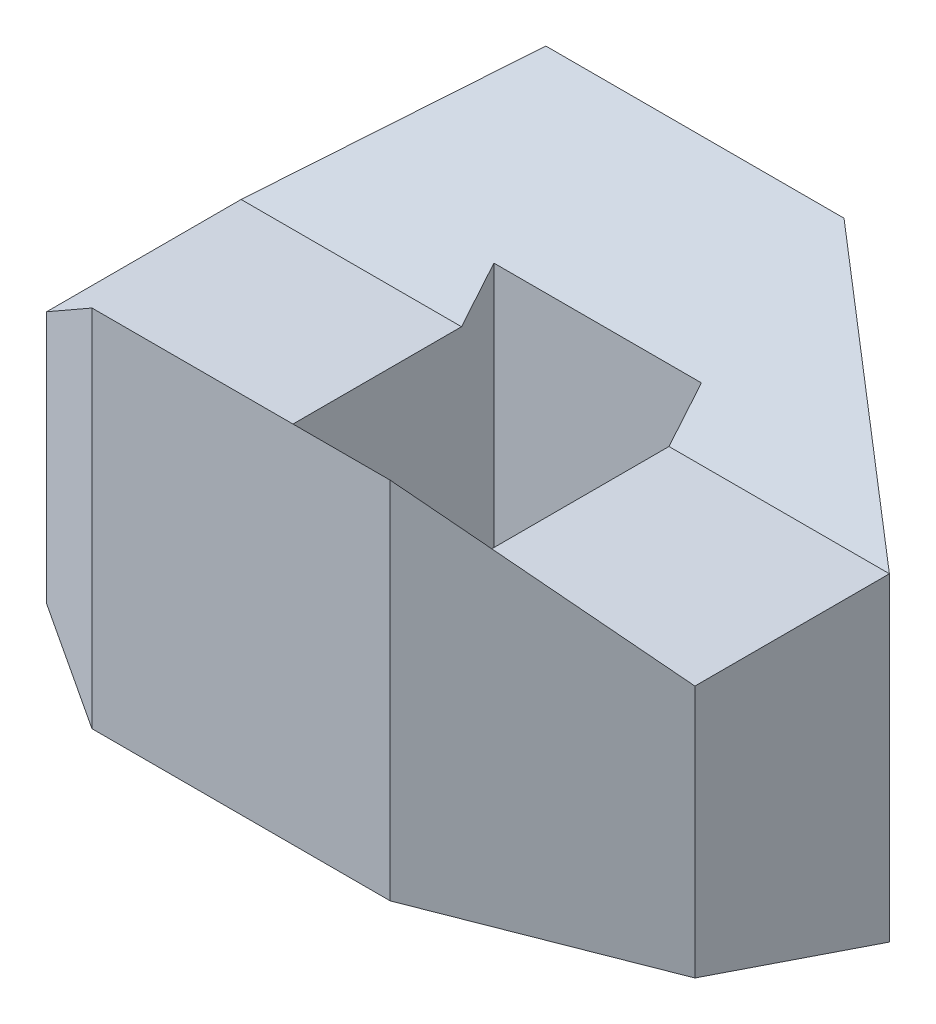
ISO-10303-21;
HEADER;
FILE_DESCRIPTION(('STEP AP214'),'2;1');
FILE_NAME('part.step','',(''),(''),'','','');
FILE_SCHEMA(('AUTOMOTIVE_DESIGN { 1 0 10303 214 1 1 1 1 }'));
ENDSEC;
DATA;
#1=APPLICATION_CONTEXT('core data for automotive mechanical design processes');
#2=APPLICATION_PROTOCOL_DEFINITION('international standard','automotive_design',2000,#1);
#3=PRODUCT_CONTEXT('',#1,'mechanical');
#4=PRODUCT('Part','Part','',(#3));
#5=PRODUCT_RELATED_PRODUCT_CATEGORY('part','',(#4));
#6=PRODUCT_DEFINITION_FORMATION('','',#4);
#7=PRODUCT_DEFINITION_CONTEXT('part definition',#1,'design');
#8=PRODUCT_DEFINITION('design','',#6,#7);
#9=PRODUCT_DEFINITION_SHAPE('','',#8);
#10=(LENGTH_UNIT() NAMED_UNIT(*) SI_UNIT(.MILLI.,.METRE.));
#11=(NAMED_UNIT(*) PLANE_ANGLE_UNIT() SI_UNIT($,.RADIAN.));
#12=(NAMED_UNIT(*) SI_UNIT($,.STERADIAN.) SOLID_ANGLE_UNIT());
#13=UNCERTAINTY_MEASURE_WITH_UNIT(LENGTH_MEASURE(1.E-05),#10,'distance_accuracy_value','');
#14=(GEOMETRIC_REPRESENTATION_CONTEXT(3) GLOBAL_UNCERTAINTY_ASSIGNED_CONTEXT((#13)) GLOBAL_UNIT_ASSIGNED_CONTEXT((#10,
#11,#12)) REPRESENTATION_CONTEXT('',''));
#15=CARTESIAN_POINT('',(0.,0.,0.));
#16=DIRECTION('',(0.,0.,1.));
#17=DIRECTION('',(1.,0.,0.));
#18=AXIS2_PLACEMENT_3D('',#15,#16,#17);
#19=CARTESIAN_POINT('',(0.,56.,0.));
#20=DIRECTION('',(0.,-1.,0.));
#21=DIRECTION('',(0.,0.,-1.));
#22=AXIS2_PLACEMENT_3D('',#19,#20,#21);
#23=PLANE('',#22);
#24=CARTESIAN_POINT('',(9.12162255450877E-08,56.,50.));
#25=DIRECTION('',(1.,0.,0.));
#26=VECTOR('',#25,1.);
#27=LINE('',#24,#26);
#28=CARTESIAN_POINT('',(9.12162255450877E-08,56.,50.));
#29=VERTEX_POINT('',#28);
#30=CARTESIAN_POINT('',(34.,56.,50.));
#31=VERTEX_POINT('',#30);
#32=EDGE_CURVE('E510',#29,#31,#27,.T.);
#33=ORIENTED_EDGE('',*,*,#32,.T.);
#34=DIRECTION('',(0.,0.,-1.));
#35=VECTOR('',#34,1.);
#36=CARTESIAN_POINT('',(34.,56.,0.));
#37=LINE('',#36,#35);
#38=CARTESIAN_POINT('',(34.,56.,20.));
#39=VERTEX_POINT('',#38);
#40=EDGE_CURVE('E714',#31,#39,#37,.T.);
#41=ORIENTED_EDGE('',*,*,#40,.T.);
#42=CARTESIAN_POINT('',(9.12162116672999E-08,56.,20.));
#43=DIRECTION('',(1.,0.,0.));
#44=VECTOR('',#43,1.);
#45=LINE('',#42,#44);
#46=CARTESIAN_POINT('',(9.12162142693851E-08,56.,20.));
#47=VERTEX_POINT('',#46);
#48=EDGE_CURVE('E293',#47,#39,#45,.T.);
#49=ORIENTED_EDGE('',*,*,#48,.F.);
#50=DIRECTION('',(0.,0.,-1.));
#51=VECTOR('',#50,1.);
#52=CARTESIAN_POINT('',(0.,55.9999999189189,0.));
#53=LINE('',#52,#51);
#54=EDGE_CURVE('E308',#29,#47,#53,.T.);
#55=ORIENTED_EDGE('',*,*,#54,.F.);
#56=EDGE_LOOP('',(#33,#41,#49,#55));
#57=FACE_BOUND('',#56,.T.);
#58=ADVANCED_FACE('F105',(#57),#23,.F.);
#59=CARTESIAN_POINT('',(59.3445527015057,0.,80.1151461470328));
#60=DIRECTION('',(0.595227550625738,0.,0.803557193344746));
#61=DIRECTION('',(0.803557193344746,0.,-0.595227550625738));
#62=AXIS2_PLACEMENT_3D('',#59,#60,#61);
#63=PLANE('',#62);
#64=DIRECTION('',(-0.787590523418659,0.198356131823959,0.583400387717525));
#65=VECTOR('',#64,1.);
#66=CARTESIAN_POINT('',(63.599945543038,26.1674211224941,76.9630033014533));
#67=LINE('',#66,#65);
#68=CARTESIAN_POINT('',(100.,17.,50.));
#69=VERTEX_POINT('',#68);
#70=CARTESIAN_POINT('',(73.,23.8,70.));
#71=VERTEX_POINT('',#70);
#72=EDGE_CURVE('E566',#69,#71,#67,.T.);
#73=ORIENTED_EDGE('',*,*,#72,.F.);
#74=CARTESIAN_POINT('',(100.,17.,50.));
#75=DIRECTION('',(0.,1.,0.));
#76=VECTOR('',#75,1.);
#77=LINE('',#74,#76);
#78=CARTESIAN_POINT('',(100.,55.999999918919,50.));
#79=VERTEX_POINT('',#78);
#80=EDGE_CURVE('E563',#69,#79,#77,.T.);
#81=ORIENTED_EDGE('',*,*,#80,.T.);
#82=DIRECTION('',(-0.653885296843961,0.581231376936029,0.484359479143675));
#83=VECTOR('',#82,1.);
#84=CARTESIAN_POINT('',(94.3624633970644,61.0111435829024,54.1759530392116));
#85=LINE('',#84,#83);
#86=CARTESIAN_POINT('',(73.,80.,70.));
#87=VERTEX_POINT('',#86);
#88=EDGE_CURVE('E298',#79,#87,#85,.T.);
#89=ORIENTED_EDGE('',*,*,#88,.T.);
#90=CARTESIAN_POINT('',(73.,23.8,70.));
#91=DIRECTION('',(0.,1.,0.));
#92=VECTOR('',#91,1.);
#93=LINE('',#90,#92);
#94=EDGE_CURVE('E483',#71,#87,#93,.T.);
#95=ORIENTED_EDGE('',*,*,#94,.F.);
#96=EDGE_LOOP('',(#73,#81,#89,#95));
#97=FACE_BOUND('',#96,.T.);
#98=ADVANCED_FACE('F403',(#97),#63,.T.);
#99=CARTESIAN_POINT('',(100.,0.,0.));
#100=DIRECTION('',(1.,0.,0.));
#101=DIRECTION('',(0.,0.,-1.));
#102=AXIS2_PLACEMENT_3D('',#99,#100,#101);
#103=PLANE('',#102);
#104=DIRECTION('',(0.,0.321902733238702,0.946772744819713));
#105=VECTOR('',#104,1.);
#106=CARTESIAN_POINT('',(100.,0.,0.));
#107=LINE('',#106,#105);
#108=CARTESIAN_POINT('',(100.,6.79999999999999,20.));
#109=VERTEX_POINT('',#108);
#110=EDGE_CURVE('E570',#109,#69,#107,.T.);
#111=ORIENTED_EDGE('',*,*,#110,.F.);
#112=CARTESIAN_POINT('',(100.,6.8,20.));
#113=DIRECTION('',(0.,1.,0.));
#114=VECTOR('',#113,1.);
#115=LINE('',#112,#114);
#116=CARTESIAN_POINT('',(99.9999999087839,56.,20.));
#117=VERTEX_POINT('',#116);
#118=EDGE_CURVE('E380',#109,#117,#115,.T.);
#119=ORIENTED_EDGE('',*,*,#118,.T.);
#120=DIRECTION('',(0.,0.,1.));
#121=VECTOR('',#120,1.);
#122=CARTESIAN_POINT('',(100.,55.999999918919,0.));
#123=LINE('',#122,#121);
#124=EDGE_CURVE('E292',#117,#79,#123,.T.);
#125=ORIENTED_EDGE('',*,*,#124,.T.);
#126=ORIENTED_EDGE('',*,*,#80,.F.);
#127=EDGE_LOOP('',(#111,#119,#125,#126));
#128=FACE_BOUND('',#127,.T.);
#129=ADVANCED_FACE('F394',(#128),#103,.T.);
#130=CARTESIAN_POINT('',(25.8635961027458,0.,-34.9158547387068));
#131=DIRECTION('',(0.595227550625738,0.,-0.803557193344746));
#132=DIRECTION('',(-0.803557193344746,0.,-0.595227550625737));
#133=AXIS2_PLACEMENT_3D('',#130,#131,#132);
#134=PLANE('',#133);
#135=DIRECTION('',(0.787590523418659,0.198356131823959,0.583400387717525));
#136=VECTOR('',#135,1.);
#137=CARTESIAN_POINT('',(27.7181852217419,-11.4043089071168,-33.5420850209319));
#138=LINE('',#137,#136);
#139=CARTESIAN_POINT('',(72.9999999999999,0.,0.));
#140=VERTEX_POINT('',#139);
#141=EDGE_CURVE('E572',#140,#109,#138,.T.);
#142=ORIENTED_EDGE('',*,*,#141,.F.);
#143=CARTESIAN_POINT('',(73.,0.,0.));
#144=DIRECTION('',(0.,1.,0.));
#145=VECTOR('',#144,1.);
#146=LINE('',#143,#145);
#147=CARTESIAN_POINT('',(73.0000000000001,80.,0.));
#148=VERTEX_POINT('',#147);
#149=EDGE_CURVE('E424',#140,#148,#146,.T.);
#150=ORIENTED_EDGE('',*,*,#149,.T.);
#151=DIRECTION('',(0.653885296843961,-0.581231376936029,0.484359479143675));
#152=VECTOR('',#151,1.);
#153=CARTESIAN_POINT('',(72.192375471131,80.7178884725311,-0.59824039175483));
#154=LINE('',#153,#152);
#155=EDGE_CURVE('E289',#148,#117,#154,.T.);
#156=ORIENTED_EDGE('',*,*,#155,.T.);
#157=ORIENTED_EDGE('',*,*,#118,.F.);
#158=EDGE_LOOP('',(#142,#150,#156,#157));
#159=FACE_BOUND('',#158,.T.);
#160=ADVANCED_FACE('F338',(#159),#134,.T.);
#161=CARTESIAN_POINT('',(0.,0.,0.));
#162=DIRECTION('',(-1.,0.,0.));
#163=DIRECTION('',(0.,0.,1.));
#164=AXIS2_PLACEMENT_3D('',#161,#162,#163);
#165=PLANE('',#164);
#166=DIRECTION('',(0.,-0.321902733238702,-0.946772744819713));
#167=VECTOR('',#166,1.);
#168=CARTESIAN_POINT('',(0.,0.,0.));
#169=LINE('',#168,#167);
#170=CARTESIAN_POINT('',(0.,17.,50.));
#171=VERTEX_POINT('',#170);
#172=CARTESIAN_POINT('',(0.,6.8,20.));
#173=VERTEX_POINT('',#172);
#174=EDGE_CURVE('E504',#171,#173,#169,.T.);
#175=ORIENTED_EDGE('',*,*,#174,.F.);
#176=CARTESIAN_POINT('',(0.,17.,50.));
#177=DIRECTION('',(0.,1.,0.));
#178=VECTOR('',#177,1.);
#179=LINE('',#176,#178);
#180=EDGE_CURVE('E502',#171,#29,#179,.T.);
#181=ORIENTED_EDGE('',*,*,#180,.T.);
#182=ORIENTED_EDGE('',*,*,#54,.T.);
#183=CARTESIAN_POINT('',(0.,6.8,20.));
#184=DIRECTION('',(0.,1.,0.));
#185=VECTOR('',#184,1.);
#186=LINE('',#183,#185);
#187=EDGE_CURVE('E370',#173,#47,#186,.T.);
#188=ORIENTED_EDGE('',*,*,#187,.F.);
#189=EDGE_LOOP('',(#175,#181,#182,#188));
#190=FACE_BOUND('',#189,.T.);
#191=ADVANCED_FACE('F328',(#190),#165,.T.);
#192=CARTESIAN_POINT('',(9.56598759964571,0.,12.9140832595217));
#193=DIRECTION('',(-0.595227550625738,0.,-0.803557193344746));
#194=DIRECTION('',(-0.803557193344746,0.,0.595227550625738));
#195=AXIS2_PLACEMENT_3D('',#192,#193,#194);
#196=PLANE('',#195);
#197=DIRECTION('',(0.787590523418659,-0.198356131823959,-0.583400387717525));
#198=VECTOR('',#197,1.);
#199=CARTESIAN_POINT('',(10.2519315203703,4.21803206153636,12.4059766515776));
#200=LINE('',#199,#198);
#201=CARTESIAN_POINT('',(27.,0.,0.));
#202=VERTEX_POINT('',#201);
#203=EDGE_CURVE('E560',#173,#202,#200,.T.);
#204=ORIENTED_EDGE('',*,*,#203,.F.);
#205=ORIENTED_EDGE('',*,*,#187,.T.);
#206=DIRECTION('',(0.653885296843961,0.581231376936029,-0.484359479143675));
#207=VECTOR('',#206,1.);
#208=CARTESIAN_POINT('',(-14.9489736140025,42.7120233282471,31.07331378815));
#209=LINE('',#208,#207);
#210=CARTESIAN_POINT('',(27.,80.,0.));
#211=VERTEX_POINT('',#210);
#212=EDGE_CURVE('E313',#47,#211,#209,.T.);
#213=ORIENTED_EDGE('',*,*,#212,.T.);
#214=CARTESIAN_POINT('',(27.,0.,0.));
#215=DIRECTION('',(0.,1.,0.));
#216=VECTOR('',#215,1.);
#217=LINE('',#214,#216);
#218=EDGE_CURVE('E436',#202,#211,#217,.T.);
#219=ORIENTED_EDGE('',*,*,#218,.F.);
#220=EDGE_LOOP('',(#204,#205,#213,#219));
#221=FACE_BOUND('',#220,.T.);
#222=ADVANCED_FACE('F337',(#221),#196,.T.);
#223=CARTESIAN_POINT('',(-23.9149689991143,0.,32.2852081488042));
#224=DIRECTION('',(-0.595227550625738,0.,0.803557193344746));
#225=DIRECTION('',(0.803557193344746,0.,0.595227550625738));
#226=AXIS2_PLACEMENT_3D('',#223,#224,#225);
#227=PLANE('',#226);
#228=DIRECTION('',(-0.787590523418659,-0.198356131823959,-0.583400387717525));
#229=VECTOR('',#228,1.);
#230=CARTESIAN_POINT('',(-25.6298288009258,10.5450801538409,31.0149416289439));
#231=LINE('',#230,#229);
#232=CARTESIAN_POINT('',(27.,23.8,70.));
#233=VERTEX_POINT('',#232);
#234=EDGE_CURVE('E522',#233,#171,#231,.T.);
#235=ORIENTED_EDGE('',*,*,#234,.F.);
#236=CARTESIAN_POINT('',(27.,23.8,70.));
#237=DIRECTION('',(0.,1.,0.));
#238=VECTOR('',#237,1.);
#239=LINE('',#236,#238);
#240=CARTESIAN_POINT('',(27.,80.,70.));
#241=VERTEX_POINT('',#240);
#242=EDGE_CURVE('E493',#233,#241,#239,.T.);
#243=ORIENTED_EDGE('',*,*,#242,.T.);
#244=DIRECTION('',(-0.653885296843961,-0.581231376936029,-0.484359479143675));
#245=VECTOR('',#244,1.);
#246=CARTESIAN_POINT('',(-37.1190615399359,23.0052784386184,22.5043988593067));
#247=LINE('',#246,#245);
#248=EDGE_CURVE('E303',#241,#29,#247,.T.);
#249=ORIENTED_EDGE('',*,*,#248,.T.);
#250=ORIENTED_EDGE('',*,*,#180,.F.);
#251=EDGE_LOOP('',(#235,#243,#249,#250));
#252=FACE_BOUND('',#251,.T.);
#253=ADVANCED_FACE('F346',(#252),#227,.T.);
#254=CARTESIAN_POINT('',(0.,0.,70.));
#255=DIRECTION('',(0.,0.,1.));
#256=DIRECTION('',(1.,0.,0.));
#257=AXIS2_PLACEMENT_3D('',#254,#255,#256);
#258=PLANE('',#257);
#259=DIRECTION('',(-1.,0.,0.));
#260=VECTOR('',#259,1.);
#261=CARTESIAN_POINT('',(0.,23.8,70.));
#262=LINE('',#261,#260);
#263=EDGE_CURVE('E759',#71,#233,#262,.T.);
#264=ORIENTED_EDGE('',*,*,#263,.F.);
#265=ORIENTED_EDGE('',*,*,#94,.T.);
#266=DIRECTION('',(-1.,0.,0.));
#267=VECTOR('',#266,1.);
#268=CARTESIAN_POINT('',(73.,80.,70.));
#269=LINE('',#268,#267);
#270=EDGE_CURVE('E449',#87,#241,#269,.T.);
#271=ORIENTED_EDGE('',*,*,#270,.T.);
#272=ORIENTED_EDGE('',*,*,#242,.F.);
#273=EDGE_LOOP('',(#264,#265,#271,#272));
#274=FACE_BOUND('',#273,.T.);
#275=ADVANCED_FACE('F454',(#274),#258,.T.);
#276=CARTESIAN_POINT('',(0.,0.,0.));
#277=DIRECTION('',(0.,0.,-1.));
#278=DIRECTION('',(-1.,0.,0.));
#279=AXIS2_PLACEMENT_3D('',#276,#277,#278);
#280=PLANE('',#279);
#281=ORIENTED_EDGE('',*,*,#218,.T.);
#282=DIRECTION('',(1.,0.,0.));
#283=VECTOR('',#282,1.);
#284=CARTESIAN_POINT('',(27.,80.,0.));
#285=LINE('',#284,#283);
#286=EDGE_CURVE('E285',#211,#148,#285,.T.);
#287=ORIENTED_EDGE('',*,*,#286,.T.);
#288=ORIENTED_EDGE('',*,*,#149,.F.);
#289=DIRECTION('',(1.,0.,0.));
#290=VECTOR('',#289,1.);
#291=CARTESIAN_POINT('',(27.,0.,0.));
#292=LINE('',#291,#290);
#293=EDGE_CURVE('E317',#202,#140,#292,.T.);
#294=ORIENTED_EDGE('',*,*,#293,.F.);
#295=EDGE_LOOP('',(#281,#287,#288,#294));
#296=FACE_BOUND('',#295,.T.);
#297=ADVANCED_FACE('F107',(#296),#280,.T.);
#298=CARTESIAN_POINT('',(0.,32.7868852459016,39.344262295082));
#299=DIRECTION('',(0.,-0.64018439966448,-0.768221279597376));
#300=DIRECTION('',(0.,0.768221279597376,-0.64018439966448));
#301=AXIS2_PLACEMENT_3D('',#298,#299,#300);
#302=PLANE('',#301);
#303=ORIENTED_EDGE('',*,*,#48,.T.);
#304=DIRECTION('',(0.,0.768221279597376,-0.64018439966448));
#305=VECTOR('',#304,1.);
#306=CARTESIAN_POINT('',(34.,32.7868852459016,39.344262295082));
#307=LINE('',#306,#305);
#308=CARTESIAN_POINT('',(34.,62.,15.));
#309=VERTEX_POINT('',#308);
#310=EDGE_CURVE('E559',#39,#309,#307,.T.);
#311=ORIENTED_EDGE('',*,*,#310,.T.);
#312=DIRECTION('',(1.,0.,0.));
#313=VECTOR('',#312,1.);
#314=CARTESIAN_POINT('',(0.,62.,15.));
#315=LINE('',#314,#313);
#316=CARTESIAN_POINT('',(66.,62.,15.));
#317=VERTEX_POINT('',#316);
#318=EDGE_CURVE('E115',#309,#317,#315,.T.);
#319=ORIENTED_EDGE('',*,*,#318,.T.);
#320=DIRECTION('',(0.,-0.768221279597376,0.64018439966448));
#321=VECTOR('',#320,1.);
#322=CARTESIAN_POINT('',(66.,32.7868852459016,39.344262295082));
#323=LINE('',#322,#321);
#324=CARTESIAN_POINT('',(66.,56.,20.));
#325=VERTEX_POINT('',#324);
#326=EDGE_CURVE('E225',#317,#325,#323,.T.);
#327=ORIENTED_EDGE('',*,*,#326,.T.);
#328=CARTESIAN_POINT('',(66.,56.,20.));
#329=DIRECTION('',(1.,0.,0.));
#330=VECTOR('',#329,1.);
#331=LINE('',#328,#330);
#332=EDGE_CURVE('E519',#325,#117,#331,.T.);
#333=ORIENTED_EDGE('',*,*,#332,.T.);
#334=ORIENTED_EDGE('',*,*,#155,.F.);
#335=ORIENTED_EDGE('',*,*,#286,.F.);
#336=ORIENTED_EDGE('',*,*,#212,.F.);
#337=EDGE_LOOP('',(#303,#311,#319,#327,#333,#334,#335,#336));
#338=FACE_BOUND('',#337,.T.);
#339=ADVANCED_FACE('F254',(#338),#302,.F.);
#340=CARTESIAN_POINT('',(0.,-1.63934426229508,1.9672131147541));
#341=DIRECTION('',(0.,-0.64018439966448,0.768221279597376));
#342=DIRECTION('',(0.,-0.768221279597376,-0.64018439966448));
#343=AXIS2_PLACEMENT_3D('',#340,#341,#342);
#344=PLANE('',#343);
#345=DIRECTION('',(-1.,0.,0.));
#346=VECTOR('',#345,1.);
#347=CARTESIAN_POINT('',(0.,62.,55.));
#348=LINE('',#347,#346);
#349=CARTESIAN_POINT('',(66.,62.,55.));
#350=VERTEX_POINT('',#349);
#351=CARTESIAN_POINT('',(34.,62.,55.));
#352=VERTEX_POINT('',#351);
#353=EDGE_CURVE('E713',#350,#352,#348,.T.);
#354=ORIENTED_EDGE('',*,*,#353,.T.);
#355=DIRECTION('',(0.,-0.768221279597376,-0.64018439966448));
#356=VECTOR('',#355,1.);
#357=CARTESIAN_POINT('',(34.,-1.63934426229508,1.9672131147541));
#358=LINE('',#357,#356);
#359=EDGE_CURVE('E518',#352,#31,#358,.T.);
#360=ORIENTED_EDGE('',*,*,#359,.T.);
#361=ORIENTED_EDGE('',*,*,#32,.F.);
#362=ORIENTED_EDGE('',*,*,#248,.F.);
#363=ORIENTED_EDGE('',*,*,#270,.F.);
#364=ORIENTED_EDGE('',*,*,#88,.F.);
#365=CARTESIAN_POINT('',(66.,56.,50.));
#366=DIRECTION('',(1.,0.,0.));
#367=VECTOR('',#366,1.);
#368=LINE('',#365,#367);
#369=CARTESIAN_POINT('',(66.,56.,50.));
#370=VERTEX_POINT('',#369);
#371=EDGE_CURVE('E520',#370,#79,#368,.T.);
#372=ORIENTED_EDGE('',*,*,#371,.F.);
#373=DIRECTION('',(0.,0.768221279597376,0.64018439966448));
#374=VECTOR('',#373,1.);
#375=CARTESIAN_POINT('',(66.,-1.63934426229508,1.9672131147541));
#376=LINE('',#375,#374);
#377=EDGE_CURVE('E130',#370,#350,#376,.T.);
#378=ORIENTED_EDGE('',*,*,#377,.T.);
#379=EDGE_LOOP('',(#354,#360,#361,#362,#363,#364,#372,#378));
#380=FACE_BOUND('',#379,.T.);
#381=ADVANCED_FACE('F259',(#380),#344,.F.);
#382=ORIENTED_EDGE('',*,*,#332,.F.);
#383=DIRECTION('',(0.,0.,1.));
#384=VECTOR('',#383,1.);
#385=CARTESIAN_POINT('',(66.,56.,0.));
#386=LINE('',#385,#384);
#387=EDGE_CURVE('E540',#325,#370,#386,.T.);
#388=ORIENTED_EDGE('',*,*,#387,.T.);
#389=ORIENTED_EDGE('',*,*,#371,.T.);
#390=ORIENTED_EDGE('',*,*,#124,.F.);
#391=EDGE_LOOP('',(#382,#388,#389,#390));
#392=FACE_BOUND('',#391,.T.);
#393=ADVANCED_FACE('F340',(#392),#23,.F.);
#394=CARTESIAN_POINT('',(0.,0.,15.));
#395=DIRECTION('',(0.,0.,-1.));
#396=DIRECTION('',(-1.,0.,0.));
#397=AXIS2_PLACEMENT_3D('',#394,#395,#396);
#398=PLANE('',#397);
#399=CARTESIAN_POINT('',(34.,5.09999999999999,15.));
#400=DIRECTION('',(0.,1.,0.));
#401=VECTOR('',#400,1.);
#402=LINE('',#399,#401);
#403=CARTESIAN_POINT('',(34.,5.1,15.));
#404=VERTEX_POINT('',#403);
#405=EDGE_CURVE('E218',#404,#309,#402,.T.);
#406=ORIENTED_EDGE('',*,*,#405,.F.);
#407=DIRECTION('',(1.,0.,0.));
#408=VECTOR('',#407,1.);
#409=CARTESIAN_POINT('',(0.,5.1,15.));
#410=LINE('',#409,#408);
#411=CARTESIAN_POINT('',(66.,5.1,15.));
#412=VERTEX_POINT('',#411);
#413=EDGE_CURVE('E207',#404,#412,#410,.T.);
#414=ORIENTED_EDGE('',*,*,#413,.T.);
#415=CARTESIAN_POINT('',(66.,5.09999999999999,15.));
#416=DIRECTION('',(0.,1.,0.));
#417=VECTOR('',#416,1.);
#418=LINE('',#415,#417);
#419=EDGE_CURVE('E215',#412,#317,#418,.T.);
#420=ORIENTED_EDGE('',*,*,#419,.T.);
#421=ORIENTED_EDGE('',*,*,#318,.F.);
#422=EDGE_LOOP('',(#406,#414,#420,#421));
#423=FACE_BOUND('',#422,.T.);
#424=ADVANCED_FACE('F213',(#423),#398,.F.);
#425=CARTESIAN_POINT('',(0.,0.,55.));
#426=DIRECTION('',(0.,0.,1.));
#427=DIRECTION('',(1.,0.,0.));
#428=AXIS2_PLACEMENT_3D('',#425,#426,#427);
#429=PLANE('',#428);
#430=CARTESIAN_POINT('',(66.,18.7,55.));
#431=DIRECTION('',(0.,1.,0.));
#432=VECTOR('',#431,1.);
#433=LINE('',#430,#432);
#434=CARTESIAN_POINT('',(66.,18.7,55.));
#435=VERTEX_POINT('',#434);
#436=EDGE_CURVE('E227',#435,#350,#433,.T.);
#437=ORIENTED_EDGE('',*,*,#436,.F.);
#438=DIRECTION('',(-1.,0.,0.));
#439=VECTOR('',#438,1.);
#440=CARTESIAN_POINT('',(0.,18.7,55.));
#441=LINE('',#440,#439);
#442=CARTESIAN_POINT('',(34.,18.7,55.));
#443=VERTEX_POINT('',#442);
#444=EDGE_CURVE('E123',#435,#443,#441,.T.);
#445=ORIENTED_EDGE('',*,*,#444,.T.);
#446=CARTESIAN_POINT('',(34.,18.7,55.));
#447=DIRECTION('',(0.,1.,0.));
#448=VECTOR('',#447,1.);
#449=LINE('',#446,#448);
#450=EDGE_CURVE('E712',#443,#352,#449,.T.);
#451=ORIENTED_EDGE('',*,*,#450,.T.);
#452=ORIENTED_EDGE('',*,*,#353,.F.);
#453=EDGE_LOOP('',(#437,#445,#451,#452));
#454=FACE_BOUND('',#453,.T.);
#455=ADVANCED_FACE('F251',(#454),#429,.F.);
#456=CARTESIAN_POINT('',(34.,0.,0.));
#457=DIRECTION('',(-1.,0.,0.));
#458=DIRECTION('',(0.,0.,1.));
#459=AXIS2_PLACEMENT_3D('',#456,#457,#458);
#460=PLANE('',#459);
#461=ORIENTED_EDGE('',*,*,#450,.F.);
#462=DIRECTION('',(0.,-0.321902733238702,-0.946772744819713));
#463=VECTOR('',#462,1.);
#464=CARTESIAN_POINT('',(34.,0.,0.));
#465=LINE('',#464,#463);
#466=EDGE_CURVE('E220',#443,#404,#465,.T.);
#467=ORIENTED_EDGE('',*,*,#466,.T.);
#468=ORIENTED_EDGE('',*,*,#405,.T.);
#469=ORIENTED_EDGE('',*,*,#310,.F.);
#470=ORIENTED_EDGE('',*,*,#40,.F.);
#471=ORIENTED_EDGE('',*,*,#359,.F.);
#472=EDGE_LOOP('',(#461,#467,#468,#469,#470,#471));
#473=FACE_BOUND('',#472,.T.);
#474=ADVANCED_FACE('F250',(#473),#460,.F.);
#475=CARTESIAN_POINT('',(66.,0.,0.));
#476=DIRECTION('',(1.,0.,0.));
#477=DIRECTION('',(0.,0.,-1.));
#478=AXIS2_PLACEMENT_3D('',#475,#476,#477);
#479=PLANE('',#478);
#480=ORIENTED_EDGE('',*,*,#419,.F.);
#481=DIRECTION('',(0.,0.321902733238702,0.946772744819713));
#482=VECTOR('',#481,1.);
#483=CARTESIAN_POINT('',(66.,0.,0.));
#484=LINE('',#483,#482);
#485=EDGE_CURVE('E12',#412,#435,#484,.T.);
#486=ORIENTED_EDGE('',*,*,#485,.T.);
#487=ORIENTED_EDGE('',*,*,#436,.T.);
#488=ORIENTED_EDGE('',*,*,#377,.F.);
#489=ORIENTED_EDGE('',*,*,#387,.F.);
#490=ORIENTED_EDGE('',*,*,#326,.F.);
#491=EDGE_LOOP('',(#480,#486,#487,#488,#489,#490));
#492=FACE_BOUND('',#491,.T.);
#493=ADVANCED_FACE('F223',(#492),#479,.F.);
#494=CARTESIAN_POINT('',(0.,0.,0.));
#495=DIRECTION('',(0.,0.946772744819713,-0.321902733238702));
#496=DIRECTION('',(0.,0.321902733238702,0.946772744819713));
#497=AXIS2_PLACEMENT_3D('',#494,#495,#496);
#498=PLANE('',#497);
#499=ORIENTED_EDGE('',*,*,#234,.T.);
#500=ORIENTED_EDGE('',*,*,#174,.T.);
#501=ORIENTED_EDGE('',*,*,#203,.T.);
#502=ORIENTED_EDGE('',*,*,#293,.T.);
#503=ORIENTED_EDGE('',*,*,#141,.T.);
#504=ORIENTED_EDGE('',*,*,#110,.T.);
#505=ORIENTED_EDGE('',*,*,#72,.T.);
#506=ORIENTED_EDGE('',*,*,#263,.T.);
#507=EDGE_LOOP('',(#499,#500,#501,#502,#503,#504,#505,#506));
#508=FACE_BOUND('',#507,.T.);
#509=ORIENTED_EDGE('',*,*,#444,.F.);
#510=ORIENTED_EDGE('',*,*,#485,.F.);
#511=ORIENTED_EDGE('',*,*,#413,.F.);
#512=ORIENTED_EDGE('',*,*,#466,.F.);
#513=EDGE_LOOP('',(#509,#510,#511,#512));
#514=FACE_BOUND('',#513,.T.);
#515=ADVANCED_FACE('F206',(#508,#514),#498,.F.);
#516=CLOSED_SHELL('',(#58,#98,#129,#160,#191,#222,#253,#275,#297,#339,#381,#393,#424,#455,#474,
#493,#515));
#517=MANIFOLD_SOLID_BREP('B2',#516);
#518=ADVANCED_BREP_SHAPE_REPRESENTATION('',(#18,#517),#14);
#519=SHAPE_DEFINITION_REPRESENTATION(#9,#518);
ENDSEC;
END-ISO-10303-21;
